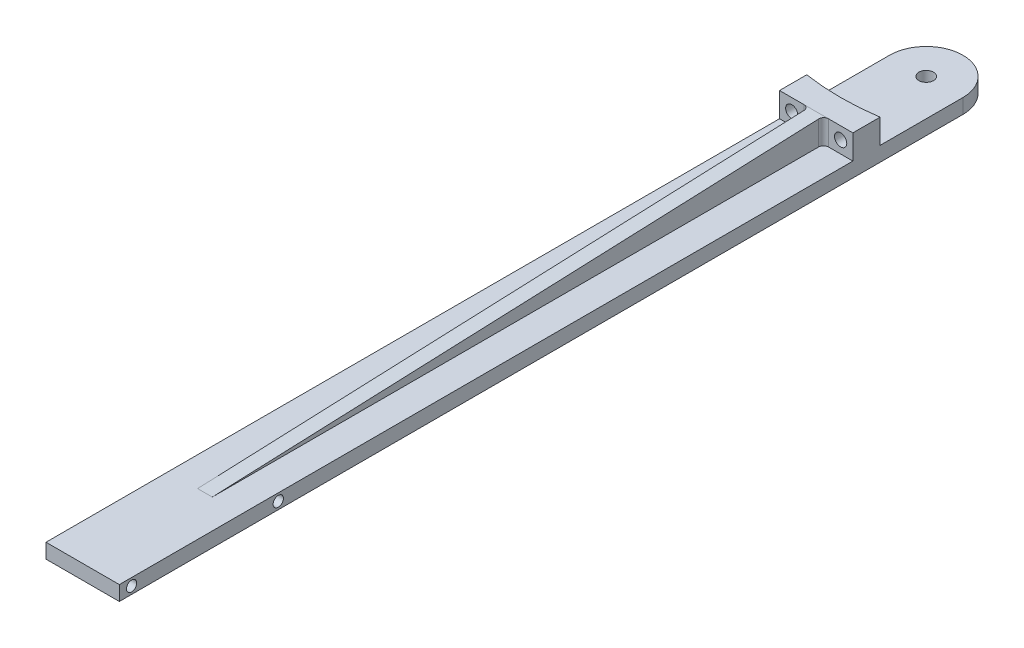
ISO-10303-21;
HEADER;
FILE_DESCRIPTION(('STEP AP214'),'2;1');
FILE_NAME('part.step','',(''),(''),'','','');
FILE_SCHEMA(('AUTOMOTIVE_DESIGN { 1 0 10303 214 1 1 1 1 }'));
ENDSEC;
DATA;
#1=APPLICATION_CONTEXT('core data for automotive mechanical design processes');
#2=APPLICATION_PROTOCOL_DEFINITION('international standard','automotive_design',2000,#1);
#3=PRODUCT_CONTEXT('',#1,'mechanical');
#4=PRODUCT('Part','Part','',(#3));
#5=PRODUCT_RELATED_PRODUCT_CATEGORY('part','',(#4));
#6=PRODUCT_DEFINITION_FORMATION('','',#4);
#7=PRODUCT_DEFINITION_CONTEXT('part definition',#1,'design');
#8=PRODUCT_DEFINITION('design','',#6,#7);
#9=PRODUCT_DEFINITION_SHAPE('','',#8);
#10=(LENGTH_UNIT() NAMED_UNIT(*) SI_UNIT(.MILLI.,.METRE.));
#11=(NAMED_UNIT(*) PLANE_ANGLE_UNIT() SI_UNIT($,.RADIAN.));
#12=(NAMED_UNIT(*) SI_UNIT($,.STERADIAN.) SOLID_ANGLE_UNIT());
#13=UNCERTAINTY_MEASURE_WITH_UNIT(LENGTH_MEASURE(1.E-05),#10,'distance_accuracy_value','');
#14=(GEOMETRIC_REPRESENTATION_CONTEXT(3) GLOBAL_UNCERTAINTY_ASSIGNED_CONTEXT((#13)) GLOBAL_UNIT_ASSIGNED_CONTEXT((#10,
#11,#12)) REPRESENTATION_CONTEXT('',''));
#15=CARTESIAN_POINT('',(0.,0.,0.));
#16=DIRECTION('',(0.,0.,1.));
#17=DIRECTION('',(1.,0.,0.));
#18=AXIS2_PLACEMENT_3D('',#15,#16,#17);
#19=CARTESIAN_POINT('',(0.,0.,300.));
#20=DIRECTION('',(1.,0.,0.));
#21=DIRECTION('',(0.,0.,-1.));
#22=AXIS2_PLACEMENT_3D('',#19,#20,#21);
#23=PLANE('',#22);
#24=DIRECTION('',(0.,0.,-1.));
#25=VECTOR('',#24,1.);
#26=CARTESIAN_POINT('',(0.,6.,300.));
#27=LINE('',#26,#25);
#28=CARTESIAN_POINT('',(0.,6.,300.));
#29=VERTEX_POINT('',#28);
#30=CARTESIAN_POINT('',(0.,6.,0.));
#31=VERTEX_POINT('',#30);
#32=EDGE_CURVE('E474',#29,#31,#27,.T.);
#33=ORIENTED_EDGE('',*,*,#32,.T.);
#34=DIRECTION('',(0.,1.,0.));
#35=VECTOR('',#34,1.);
#36=CARTESIAN_POINT('',(0.,0.,0.));
#37=LINE('',#36,#35);
#38=CARTESIAN_POINT('',(0.,16.,0.));
#39=VERTEX_POINT('',#38);
#40=EDGE_CURVE('E508',#31,#39,#37,.T.);
#41=ORIENTED_EDGE('',*,*,#40,.T.);
#42=DIRECTION('',(0.,0.,1.));
#43=VECTOR('',#42,1.);
#44=CARTESIAN_POINT('',(0.,16.,-10.));
#45=LINE('',#44,#43);
#46=CARTESIAN_POINT('',(0.,16.,-11.1314003335741));
#47=VERTEX_POINT('',#46);
#48=EDGE_CURVE('E497',#47,#39,#45,.T.);
#49=ORIENTED_EDGE('',*,*,#48,.F.);
#50=DIRECTION('',(0.,1.,0.));
#51=VECTOR('',#50,1.);
#52=CARTESIAN_POINT('',(0.,6.,-11.1314003335741));
#53=LINE('',#52,#51);
#54=CARTESIAN_POINT('',(0.,6.,-11.131400333574));
#55=VERTEX_POINT('',#54);
#56=EDGE_CURVE('E576',#55,#47,#53,.T.);
#57=ORIENTED_EDGE('',*,*,#56,.F.);
#58=DIRECTION('',(0.,0.,-1.));
#59=VECTOR('',#58,1.);
#60=CARTESIAN_POINT('',(0.,6.,-10.));
#61=LINE('',#60,#59);
#62=CARTESIAN_POINT('',(0.,6.,-45.));
#63=VERTEX_POINT('',#62);
#64=EDGE_CURVE('E525',#55,#63,#61,.T.);
#65=ORIENTED_EDGE('',*,*,#64,.T.);
#66=DIRECTION('',(0.,-1.,0.));
#67=VECTOR('',#66,1.);
#68=CARTESIAN_POINT('',(0.,6.,-45.));
#69=LINE('',#68,#67);
#70=CARTESIAN_POINT('',(0.,0.,-45.));
#71=VERTEX_POINT('',#70);
#72=EDGE_CURVE('E462',#63,#71,#69,.T.);
#73=ORIENTED_EDGE('',*,*,#72,.T.);
#74=DIRECTION('',(0.,0.,-1.));
#75=VECTOR('',#74,1.);
#76=CARTESIAN_POINT('',(0.,0.,300.));
#77=LINE('',#76,#75);
#78=CARTESIAN_POINT('',(0.,0.,300.));
#79=VERTEX_POINT('',#78);
#80=EDGE_CURVE('E156',#79,#71,#77,.T.);
#81=ORIENTED_EDGE('',*,*,#80,.F.);
#82=DIRECTION('',(0.,-1.,0.));
#83=VECTOR('',#82,1.);
#84=CARTESIAN_POINT('',(0.,0.,300.));
#85=LINE('',#84,#83);
#86=EDGE_CURVE('E117',#29,#79,#85,.T.);
#87=ORIENTED_EDGE('',*,*,#86,.F.);
#88=EDGE_LOOP('',(#33,#41,#49,#57,#65,#73,#81,#87));
#89=FACE_BOUND('',#88,.T.);
#90=CARTESIAN_POINT('',(0.,2.99999999999999,235.));
#91=DIRECTION('',(-1.,0.,0.));
#92=DIRECTION('',(0.,0.,1.));
#93=AXIS2_PLACEMENT_3D('',#90,#91,#92);
#94=CIRCLE('',#93,2.09999999999999);
#95=CARTESIAN_POINT('',(0.,2.99999999999999,237.1));
#96=VERTEX_POINT('',#95);
#97=EDGE_CURVE('E544',#96,#96,#94,.T.);
#98=ORIENTED_EDGE('',*,*,#97,.F.);
#99=EDGE_LOOP('',(#98));
#100=FACE_BOUND('',#99,.T.);
#101=CARTESIAN_POINT('',(0.,3.,295.));
#102=DIRECTION('',(-1.,0.,0.));
#103=DIRECTION('',(0.,0.,1.));
#104=AXIS2_PLACEMENT_3D('',#101,#102,#103);
#105=CIRCLE('',#104,2.09999999999999);
#106=CARTESIAN_POINT('',(0.,3.,297.1));
#107=VERTEX_POINT('',#106);
#108=EDGE_CURVE('E553',#107,#107,#105,.T.);
#109=ORIENTED_EDGE('',*,*,#108,.F.);
#110=EDGE_LOOP('',(#109));
#111=FACE_BOUND('',#110,.T.);
#112=ADVANCED_FACE('F41',(#89,#100,#111),#23,.F.);
#113=CARTESIAN_POINT('',(0.,0.,300.));
#114=DIRECTION('',(0.,1.,0.));
#115=DIRECTION('',(0.,0.,1.));
#116=AXIS2_PLACEMENT_3D('',#113,#114,#115);
#117=PLANE('',#116);
#118=ORIENTED_EDGE('',*,*,#80,.T.);
#119=CARTESIAN_POINT('',(15.,0.,-45.));
#120=DIRECTION('',(0.,-1.,0.));
#121=DIRECTION('',(0.,0.,-1.));
#122=AXIS2_PLACEMENT_3D('',#119,#120,#121);
#123=CIRCLE('',#122,15.);
#124=CARTESIAN_POINT('',(30.,0.,-45.));
#125=VERTEX_POINT('',#124);
#126=EDGE_CURVE('E522',#71,#125,#123,.T.);
#127=ORIENTED_EDGE('',*,*,#126,.T.);
#128=DIRECTION('',(0.,0.,-1.));
#129=VECTOR('',#128,1.);
#130=CARTESIAN_POINT('',(30.,0.,300.));
#131=LINE('',#130,#129);
#132=CARTESIAN_POINT('',(30.,0.,300.));
#133=VERTEX_POINT('',#132);
#134=EDGE_CURVE('E466',#133,#125,#131,.T.);
#135=ORIENTED_EDGE('',*,*,#134,.F.);
#136=DIRECTION('',(1.,0.,0.));
#137=VECTOR('',#136,1.);
#138=CARTESIAN_POINT('',(0.,0.,300.));
#139=LINE('',#138,#137);
#140=EDGE_CURVE('E448',#79,#133,#139,.T.);
#141=ORIENTED_EDGE('',*,*,#140,.F.);
#142=EDGE_LOOP('',(#118,#127,#135,#141));
#143=FACE_BOUND('',#142,.T.);
#144=CARTESIAN_POINT('',(15.,0.,-45.));
#145=DIRECTION('',(0.,-1.,0.));
#146=DIRECTION('',(0.,0.,-1.));
#147=AXIS2_PLACEMENT_3D('',#144,#145,#146);
#148=CIRCLE('',#147,2.99999999999999);
#149=CARTESIAN_POINT('',(15.,0.,-48.));
#150=VERTEX_POINT('',#149);
#151=EDGE_CURVE('E536',#150,#150,#148,.T.);
#152=ORIENTED_EDGE('',*,*,#151,.F.);
#153=EDGE_LOOP('',(#152));
#154=FACE_BOUND('',#153,.T.);
#155=ADVANCED_FACE('F193',(#143,#154),#117,.F.);
#156=CARTESIAN_POINT('',(30.,0.,300.));
#157=DIRECTION('',(-1.,0.,0.));
#158=DIRECTION('',(0.,0.,1.));
#159=AXIS2_PLACEMENT_3D('',#156,#157,#158);
#160=PLANE('',#159);
#161=DIRECTION('',(0.,-1.,0.));
#162=VECTOR('',#161,1.);
#163=CARTESIAN_POINT('',(30.,0.,0.));
#164=LINE('',#163,#162);
#165=CARTESIAN_POINT('',(30.,16.,0.));
#166=VERTEX_POINT('',#165);
#167=CARTESIAN_POINT('',(30.,6.,0.));
#168=VERTEX_POINT('',#167);
#169=EDGE_CURVE('E512',#166,#168,#164,.T.);
#170=ORIENTED_EDGE('',*,*,#169,.T.);
#171=DIRECTION('',(0.,0.,-1.));
#172=VECTOR('',#171,1.);
#173=CARTESIAN_POINT('',(30.,6.,300.));
#174=LINE('',#173,#172);
#175=CARTESIAN_POINT('',(30.,6.,300.));
#176=VERTEX_POINT('',#175);
#177=EDGE_CURVE('E115',#176,#168,#174,.T.);
#178=ORIENTED_EDGE('',*,*,#177,.F.);
#179=DIRECTION('',(0.,1.,0.));
#180=VECTOR('',#179,1.);
#181=CARTESIAN_POINT('',(30.,0.,300.));
#182=LINE('',#181,#180);
#183=EDGE_CURVE('E479',#133,#176,#182,.T.);
#184=ORIENTED_EDGE('',*,*,#183,.F.);
#185=ORIENTED_EDGE('',*,*,#134,.T.);
#186=DIRECTION('',(0.,-1.,0.));
#187=VECTOR('',#186,1.);
#188=CARTESIAN_POINT('',(30.,6.,-45.));
#189=LINE('',#188,#187);
#190=CARTESIAN_POINT('',(30.,6.,-45.));
#191=VERTEX_POINT('',#190);
#192=EDGE_CURVE('E515',#191,#125,#189,.T.);
#193=ORIENTED_EDGE('',*,*,#192,.F.);
#194=DIRECTION('',(0.,0.,1.));
#195=VECTOR('',#194,1.);
#196=CARTESIAN_POINT('',(30.,6.,-45.));
#197=LINE('',#196,#195);
#198=CARTESIAN_POINT('',(30.,6.,-11.1314003335741));
#199=VERTEX_POINT('',#198);
#200=EDGE_CURVE('E518',#191,#199,#197,.T.);
#201=ORIENTED_EDGE('',*,*,#200,.T.);
#202=DIRECTION('',(0.,1.,0.));
#203=VECTOR('',#202,1.);
#204=CARTESIAN_POINT('',(30.,6.,-11.1314003335741));
#205=LINE('',#204,#203);
#206=CARTESIAN_POINT('',(30.,16.,-11.1314003335741));
#207=VERTEX_POINT('',#206);
#208=EDGE_CURVE('E565',#199,#207,#205,.T.);
#209=ORIENTED_EDGE('',*,*,#208,.T.);
#210=DIRECTION('',(0.,0.,1.));
#211=VECTOR('',#210,1.);
#212=CARTESIAN_POINT('',(30.,16.,-10.));
#213=LINE('',#212,#211);
#214=EDGE_CURVE('E501',#207,#166,#213,.T.);
#215=ORIENTED_EDGE('',*,*,#214,.T.);
#216=EDGE_LOOP('',(#170,#178,#184,#185,#193,#201,#209,#215));
#217=FACE_BOUND('',#216,.T.);
#218=CARTESIAN_POINT('',(30.,2.99999999999999,235.));
#219=DIRECTION('',(-1.,0.,0.));
#220=DIRECTION('',(0.,0.,1.));
#221=AXIS2_PLACEMENT_3D('',#218,#219,#220);
#222=CIRCLE('',#221,2.09999999999999);
#223=CARTESIAN_POINT('',(30.,2.99999999999999,237.1));
#224=VERTEX_POINT('',#223);
#225=EDGE_CURVE('E560',#224,#224,#222,.T.);
#226=ORIENTED_EDGE('',*,*,#225,.T.);
#227=EDGE_LOOP('',(#226));
#228=FACE_BOUND('',#227,.T.);
#229=CARTESIAN_POINT('',(30.,3.,295.));
#230=DIRECTION('',(-1.,0.,0.));
#231=DIRECTION('',(0.,0.,1.));
#232=AXIS2_PLACEMENT_3D('',#229,#230,#231);
#233=CIRCLE('',#232,2.09999999999999);
#234=CARTESIAN_POINT('',(30.,3.,297.1));
#235=VERTEX_POINT('',#234);
#236=EDGE_CURVE('E569',#235,#235,#233,.T.);
#237=ORIENTED_EDGE('',*,*,#236,.T.);
#238=EDGE_LOOP('',(#237));
#239=FACE_BOUND('',#238,.T.);
#240=ADVANCED_FACE('F199',(#217,#228,#239),#160,.F.);
#241=CARTESIAN_POINT('',(0.,6.,300.));
#242=DIRECTION('',(0.,-1.,0.));
#243=DIRECTION('',(0.,0.,-1.));
#244=AXIS2_PLACEMENT_3D('',#241,#242,#243);
#245=PLANE('',#244);
#246=DIRECTION('',(0.,0.,-1.));
#247=VECTOR('',#246,1.);
#248=CARTESIAN_POINT('',(12.,6.,0.));
#249=LINE('',#248,#247);
#250=CARTESIAN_POINT('',(12.,6.,250.));
#251=VERTEX_POINT('',#250);
#252=CARTESIAN_POINT('',(12.,6.,2.));
#253=VERTEX_POINT('',#252);
#254=EDGE_CURVE('E145',#251,#253,#249,.T.);
#255=ORIENTED_EDGE('',*,*,#254,.T.);
#256=CARTESIAN_POINT('',(10.,6.,2.));
#257=DIRECTION('',(0.,-1.,0.));
#258=DIRECTION('',(0.,0.,-1.));
#259=AXIS2_PLACEMENT_3D('',#256,#257,#258);
#260=CIRCLE('',#259,2.);
#261=CARTESIAN_POINT('',(10.,6.,0.));
#262=VERTEX_POINT('',#261);
#263=EDGE_CURVE('E86',#253,#262,#260,.F.);
#264=ORIENTED_EDGE('',*,*,#263,.T.);
#265=DIRECTION('',(-1.,0.,0.));
#266=VECTOR('',#265,1.);
#267=CARTESIAN_POINT('',(0.,6.,0.));
#268=LINE('',#267,#266);
#269=EDGE_CURVE('E118',#262,#31,#268,.T.);
#270=ORIENTED_EDGE('',*,*,#269,.T.);
#271=ORIENTED_EDGE('',*,*,#32,.F.);
#272=DIRECTION('',(-1.,0.,0.));
#273=VECTOR('',#272,1.);
#274=CARTESIAN_POINT('',(0.,6.,300.));
#275=LINE('',#274,#273);
#276=EDGE_CURVE('E451',#176,#29,#275,.T.);
#277=ORIENTED_EDGE('',*,*,#276,.F.);
#278=ORIENTED_EDGE('',*,*,#177,.T.);
#279=CARTESIAN_POINT('',(20.,6.,0.));
#280=VERTEX_POINT('',#279);
#281=EDGE_CURVE('E101',#168,#280,#268,.T.);
#282=ORIENTED_EDGE('',*,*,#281,.T.);
#283=CARTESIAN_POINT('',(20.,6.,2.));
#284=DIRECTION('',(0.,-1.,0.));
#285=DIRECTION('',(0.,0.,-1.));
#286=AXIS2_PLACEMENT_3D('',#283,#284,#285);
#287=CIRCLE('',#286,2.);
#288=CARTESIAN_POINT('',(18.,6.,2.));
#289=VERTEX_POINT('',#288);
#290=EDGE_CURVE('E111',#280,#289,#287,.F.);
#291=ORIENTED_EDGE('',*,*,#290,.T.);
#292=DIRECTION('',(0.,0.,-1.));
#293=VECTOR('',#292,1.);
#294=CARTESIAN_POINT('',(18.,6.,0.));
#295=LINE('',#294,#293);
#296=CARTESIAN_POINT('',(18.,6.,250.));
#297=VERTEX_POINT('',#296);
#298=EDGE_CURVE('E147',#297,#289,#295,.T.);
#299=ORIENTED_EDGE('',*,*,#298,.F.);
#300=DIRECTION('',(-1.,0.,0.));
#301=VECTOR('',#300,1.);
#302=CARTESIAN_POINT('',(18.,6.,250.));
#303=LINE('',#302,#301);
#304=EDGE_CURVE('E486',#297,#251,#303,.T.);
#305=ORIENTED_EDGE('',*,*,#304,.T.);
#306=EDGE_LOOP('',(#255,#264,#270,#271,#277,#278,#282,#291,#299,#305));
#307=FACE_BOUND('',#306,.T.);
#308=ADVANCED_FACE('F109',(#307),#245,.F.);
#309=CARTESIAN_POINT('',(0.,0.,300.));
#310=DIRECTION('',(0.,0.,-1.));
#311=DIRECTION('',(-1.,0.,0.));
#312=AXIS2_PLACEMENT_3D('',#309,#310,#311);
#313=PLANE('',#312);
#314=ORIENTED_EDGE('',*,*,#86,.T.);
#315=ORIENTED_EDGE('',*,*,#140,.T.);
#316=ORIENTED_EDGE('',*,*,#183,.T.);
#317=ORIENTED_EDGE('',*,*,#276,.T.);
#318=EDGE_LOOP('',(#314,#315,#316,#317));
#319=FACE_BOUND('',#318,.T.);
#320=ADVANCED_FACE('F277',(#319),#313,.F.);
#321=CARTESIAN_POINT('',(18.,6.,250.));
#322=DIRECTION('',(0.,-0.999200958721789,-0.0399680383488716));
#323=DIRECTION('',(0.,0.0399680383488716,-0.99920095872179));
#324=AXIS2_PLACEMENT_3D('',#321,#322,#323);
#325=PLANE('',#324);
#326=DIRECTION('',(-1.,0.,0.));
#327=VECTOR('',#326,1.);
#328=CARTESIAN_POINT('',(18.,16.,0.));
#329=LINE('',#328,#327);
#330=CARTESIAN_POINT('',(20.,16.,0.));
#331=VERTEX_POINT('',#330);
#332=CARTESIAN_POINT('',(10.,16.,0.));
#333=VERTEX_POINT('',#332);
#334=EDGE_CURVE('E57',#331,#333,#329,.T.);
#335=ORIENTED_EDGE('',*,*,#334,.T.);
#336=CARTESIAN_POINT('',(10.,15.92,2.));
#337=DIRECTION('',(0.,-0.999200958721789,-0.0399680383488716));
#338=DIRECTION('',(0.,0.0399680383488716,-0.99920095872179));
#339=AXIS2_PLACEMENT_3D('',#336,#337,#338);
#340=ELLIPSE('',#339,2.00159936051149,2.);
#341=CARTESIAN_POINT('',(12.,15.92,2.00000000000009));
#342=VERTEX_POINT('',#341);
#343=EDGE_CURVE('E50',#333,#342,#340,.T.);
#344=ORIENTED_EDGE('',*,*,#343,.T.);
#345=DIRECTION('',(0.,-0.0399680383488716,0.999200958721789));
#346=VECTOR('',#345,1.);
#347=CARTESIAN_POINT('',(12.,6.,250.));
#348=LINE('',#347,#346);
#349=EDGE_CURVE('E136',#342,#251,#348,.T.);
#350=ORIENTED_EDGE('',*,*,#349,.T.);
#351=ORIENTED_EDGE('',*,*,#304,.F.);
#352=DIRECTION('',(0.,-0.0399680383488716,0.999200958721789));
#353=VECTOR('',#352,1.);
#354=CARTESIAN_POINT('',(18.,6.,250.));
#355=LINE('',#354,#353);
#356=CARTESIAN_POINT('',(18.,15.92,2.00000000000009));
#357=VERTEX_POINT('',#356);
#358=EDGE_CURVE('E489',#357,#297,#355,.T.);
#359=ORIENTED_EDGE('',*,*,#358,.F.);
#360=CARTESIAN_POINT('',(20.,15.92,2.));
#361=DIRECTION('',(0.,-0.999200958721789,-0.0399680383488716));
#362=DIRECTION('',(0.,-0.0399680383488716,0.99920095872179));
#363=AXIS2_PLACEMENT_3D('',#360,#361,#362);
#364=ELLIPSE('',#363,2.00159936051149,2.);
#365=EDGE_CURVE('E11',#357,#331,#364,.T.);
#366=ORIENTED_EDGE('',*,*,#365,.T.);
#367=EDGE_LOOP('',(#335,#344,#350,#351,#359,#366));
#368=FACE_BOUND('',#367,.T.);
#369=ADVANCED_FACE('F134',(#368),#325,.F.);
#370=CARTESIAN_POINT('',(18.,0.,0.));
#371=DIRECTION('',(1.,0.,0.));
#372=DIRECTION('',(0.,0.,-1.));
#373=AXIS2_PLACEMENT_3D('',#370,#371,#372);
#374=PLANE('',#373);
#375=ORIENTED_EDGE('',*,*,#298,.T.);
#376=DIRECTION('',(0.,1.,0.));
#377=VECTOR('',#376,1.);
#378=CARTESIAN_POINT('',(18.,16.,2.));
#379=LINE('',#378,#377);
#380=EDGE_CURVE('E106',#289,#357,#379,.T.);
#381=ORIENTED_EDGE('',*,*,#380,.T.);
#382=ORIENTED_EDGE('',*,*,#358,.T.);
#383=EDGE_LOOP('',(#375,#381,#382));
#384=FACE_BOUND('',#383,.T.);
#385=ADVANCED_FACE('F258',(#384),#374,.T.);
#386=CARTESIAN_POINT('',(12.,0.,0.));
#387=DIRECTION('',(1.,0.,0.));
#388=DIRECTION('',(0.,0.,-1.));
#389=AXIS2_PLACEMENT_3D('',#386,#387,#388);
#390=PLANE('',#389);
#391=ORIENTED_EDGE('',*,*,#349,.F.);
#392=DIRECTION('',(0.,1.,0.));
#393=VECTOR('',#392,1.);
#394=CARTESIAN_POINT('',(12.,0.,2.));
#395=LINE('',#394,#393);
#396=EDGE_CURVE('E121',#342,#253,#395,.F.);
#397=ORIENTED_EDGE('',*,*,#396,.T.);
#398=ORIENTED_EDGE('',*,*,#254,.F.);
#399=EDGE_LOOP('',(#391,#397,#398));
#400=FACE_BOUND('',#399,.T.);
#401=ADVANCED_FACE('F144',(#400),#390,.F.);
#402=CARTESIAN_POINT('',(0.,0.,0.));
#403=DIRECTION('',(0.,0.,1.));
#404=DIRECTION('',(1.,0.,0.));
#405=AXIS2_PLACEMENT_3D('',#402,#403,#404);
#406=PLANE('',#405);
#407=CARTESIAN_POINT('',(5.,11.,0.));
#408=DIRECTION('',(0.,0.,1.));
#409=DIRECTION('',(1.,0.,0.));
#410=AXIS2_PLACEMENT_3D('',#407,#408,#409);
#411=CIRCLE('',#410,2.5);
#412=CARTESIAN_POINT('',(7.5,11.,0.));
#413=VERTEX_POINT('',#412);
#414=EDGE_CURVE('E590',#413,#413,#411,.T.);
#415=ORIENTED_EDGE('',*,*,#414,.F.);
#416=EDGE_LOOP('',(#415));
#417=FACE_BOUND('',#416,.T.);
#418=ORIENTED_EDGE('',*,*,#269,.F.);
#419=DIRECTION('',(0.,1.,0.));
#420=VECTOR('',#419,1.);
#421=CARTESIAN_POINT('',(10.,0.,0.));
#422=LINE('',#421,#420);
#423=EDGE_CURVE('E126',#262,#333,#422,.T.);
#424=ORIENTED_EDGE('',*,*,#423,.T.);
#425=DIRECTION('',(1.,0.,0.));
#426=VECTOR('',#425,1.);
#427=CARTESIAN_POINT('',(30.,16.,0.));
#428=LINE('',#427,#426);
#429=EDGE_CURVE('E505',#39,#333,#428,.T.);
#430=ORIENTED_EDGE('',*,*,#429,.F.);
#431=ORIENTED_EDGE('',*,*,#40,.F.);
#432=EDGE_LOOP('',(#418,#424,#430,#431));
#433=FACE_BOUND('',#432,.T.);
#434=ADVANCED_FACE('F239',(#417,#433),#406,.T.);
#435=CARTESIAN_POINT('',(25.,11.,0.));
#436=DIRECTION('',(0.,0.,1.));
#437=DIRECTION('',(-1.,0.,0.));
#438=AXIS2_PLACEMENT_3D('',#435,#436,#437);
#439=CIRCLE('',#438,2.5);
#440=CARTESIAN_POINT('',(22.5,11.,0.));
#441=VERTEX_POINT('',#440);
#442=EDGE_CURVE('E586',#441,#441,#439,.T.);
#443=ORIENTED_EDGE('',*,*,#442,.F.);
#444=EDGE_LOOP('',(#443));
#445=FACE_BOUND('',#444,.T.);
#446=EDGE_CURVE('E103',#331,#166,#428,.T.);
#447=ORIENTED_EDGE('',*,*,#446,.F.);
#448=DIRECTION('',(0.,1.,0.));
#449=VECTOR('',#448,1.);
#450=CARTESIAN_POINT('',(20.,6.,0.));
#451=LINE('',#450,#449);
#452=EDGE_CURVE('E96',#331,#280,#451,.F.);
#453=ORIENTED_EDGE('',*,*,#452,.T.);
#454=ORIENTED_EDGE('',*,*,#281,.F.);
#455=ORIENTED_EDGE('',*,*,#169,.F.);
#456=EDGE_LOOP('',(#447,#453,#454,#455));
#457=FACE_BOUND('',#456,.T.);
#458=ADVANCED_FACE('F98',(#445,#457),#406,.T.);
#459=CARTESIAN_POINT('',(30.,16.,-10.));
#460=DIRECTION('',(0.,-1.,0.));
#461=DIRECTION('',(1.,0.,0.));
#462=AXIS2_PLACEMENT_3D('',#459,#460,#461);
#463=PLANE('',#462);
#464=ORIENTED_EDGE('',*,*,#429,.T.);
#465=ORIENTED_EDGE('',*,*,#334,.F.);
#466=ORIENTED_EDGE('',*,*,#446,.T.);
#467=ORIENTED_EDGE('',*,*,#214,.F.);
#468=CARTESIAN_POINT('',(15.,16.,-110.));
#469=DIRECTION('',(0.,-1.,0.));
#470=DIRECTION('',(-1.,0.,0.));
#471=AXIS2_PLACEMENT_3D('',#468,#469,#470);
#472=CIRCLE('',#471,100.);
#473=EDGE_CURVE('E168',#207,#47,#472,.T.);
#474=ORIENTED_EDGE('',*,*,#473,.T.);
#475=ORIENTED_EDGE('',*,*,#48,.T.);
#476=EDGE_LOOP('',(#464,#465,#466,#467,#474,#475));
#477=FACE_BOUND('',#476,.T.);
#478=ADVANCED_FACE('F221',(#477),#463,.F.);
#479=CARTESIAN_POINT('',(15.,6.,-45.));
#480=DIRECTION('',(0.,-1.,0.));
#481=DIRECTION('',(0.,0.,-1.));
#482=AXIS2_PLACEMENT_3D('',#479,#480,#481);
#483=CYLINDRICAL_SURFACE('',#482,15.);
#484=ORIENTED_EDGE('',*,*,#126,.F.);
#485=ORIENTED_EDGE('',*,*,#72,.F.);
#486=CARTESIAN_POINT('',(15.,6.,-45.));
#487=DIRECTION('',(0.,-1.,0.));
#488=DIRECTION('',(0.,0.,-1.));
#489=AXIS2_PLACEMENT_3D('',#486,#487,#488);
#490=CIRCLE('',#489,15.);
#491=EDGE_CURVE('E530',#63,#191,#490,.T.);
#492=ORIENTED_EDGE('',*,*,#491,.T.);
#493=ORIENTED_EDGE('',*,*,#192,.T.);
#494=EDGE_LOOP('',(#484,#485,#492,#493));
#495=FACE_BOUND('',#494,.T.);
#496=ADVANCED_FACE('F226',(#495),#483,.T.);
#497=CARTESIAN_POINT('',(15.,6.,-45.));
#498=DIRECTION('',(0.,-1.,0.));
#499=DIRECTION('',(0.,0.,-1.));
#500=AXIS2_PLACEMENT_3D('',#497,#498,#499);
#501=PLANE('',#500);
#502=CARTESIAN_POINT('',(15.,6.,-45.));
#503=DIRECTION('',(0.,-1.,0.));
#504=DIRECTION('',(0.,0.,-1.));
#505=AXIS2_PLACEMENT_3D('',#502,#503,#504);
#506=CIRCLE('',#505,2.99999999999999);
#507=CARTESIAN_POINT('',(15.,6.,-48.));
#508=VERTEX_POINT('',#507);
#509=EDGE_CURVE('E526',#508,#508,#506,.T.);
#510=ORIENTED_EDGE('',*,*,#509,.T.);
#511=EDGE_LOOP('',(#510));
#512=FACE_BOUND('',#511,.T.);
#513=ORIENTED_EDGE('',*,*,#64,.F.);
#514=CARTESIAN_POINT('',(15.,6.,-110.));
#515=DIRECTION('',(0.,-1.,0.));
#516=DIRECTION('',(0.,0.,-1.));
#517=AXIS2_PLACEMENT_3D('',#514,#515,#516);
#518=CIRCLE('',#517,100.);
#519=EDGE_CURVE('E153',#55,#199,#518,.F.);
#520=ORIENTED_EDGE('',*,*,#519,.T.);
#521=ORIENTED_EDGE('',*,*,#200,.F.);
#522=ORIENTED_EDGE('',*,*,#491,.F.);
#523=EDGE_LOOP('',(#513,#520,#521,#522));
#524=FACE_BOUND('',#523,.T.);
#525=ADVANCED_FACE('F309',(#512,#524),#501,.F.);
#526=CARTESIAN_POINT('',(15.,6.,-45.));
#527=DIRECTION('',(0.,-1.,0.));
#528=DIRECTION('',(0.,0.,-1.));
#529=AXIS2_PLACEMENT_3D('',#526,#527,#528);
#530=CYLINDRICAL_SURFACE('',#529,2.99999999999999);
#531=ORIENTED_EDGE('',*,*,#509,.F.);
#532=EDGE_LOOP('',(#531));
#533=FACE_BOUND('',#532,.T.);
#534=ORIENTED_EDGE('',*,*,#151,.T.);
#535=EDGE_LOOP('',(#534));
#536=FACE_BOUND('',#535,.T.);
#537=ADVANCED_FACE('F314',(#533,#536),#530,.F.);
#538=CARTESIAN_POINT('',(12.,2.99999999999999,235.));
#539=DIRECTION('',(-1.,0.,0.));
#540=DIRECTION('',(0.,0.,1.));
#541=AXIS2_PLACEMENT_3D('',#538,#539,#540);
#542=CYLINDRICAL_SURFACE('',#541,2.09999999999999);
#543=CARTESIAN_POINT('',(12.,2.99999999999999,235.));
#544=DIRECTION('',(-1.,0.,0.));
#545=DIRECTION('',(0.,0.,1.));
#546=AXIS2_PLACEMENT_3D('',#543,#544,#545);
#547=CIRCLE('',#546,2.09999999999999);
#548=CARTESIAN_POINT('',(12.,2.99999999999999,237.1));
#549=VERTEX_POINT('',#548);
#550=EDGE_CURVE('E548',#549,#549,#547,.T.);
#551=ORIENTED_EDGE('',*,*,#550,.F.);
#552=EDGE_LOOP('',(#551));
#553=FACE_BOUND('',#552,.T.);
#554=ORIENTED_EDGE('',*,*,#97,.T.);
#555=EDGE_LOOP('',(#554));
#556=FACE_BOUND('',#555,.T.);
#557=ADVANCED_FACE('F397',(#553,#556),#542,.F.);
#558=CARTESIAN_POINT('',(12.,2.99999999999999,235.));
#559=DIRECTION('',(-1.,0.,0.));
#560=DIRECTION('',(0.,0.,1.));
#561=AXIS2_PLACEMENT_3D('',#558,#559,#560);
#562=PLANE('',#561);
#563=ORIENTED_EDGE('',*,*,#550,.T.);
#564=EDGE_LOOP('',(#563));
#565=FACE_BOUND('',#564,.T.);
#566=ADVANCED_FACE('F387',(#565),#562,.T.);
#567=CARTESIAN_POINT('',(12.,3.,295.));
#568=DIRECTION('',(-1.,0.,0.));
#569=DIRECTION('',(0.,0.,1.));
#570=AXIS2_PLACEMENT_3D('',#567,#568,#569);
#571=CYLINDRICAL_SURFACE('',#570,2.09999999999999);
#572=CARTESIAN_POINT('',(12.,3.,295.));
#573=DIRECTION('',(-1.,0.,0.));
#574=DIRECTION('',(0.,0.,1.));
#575=AXIS2_PLACEMENT_3D('',#572,#573,#574);
#576=CIRCLE('',#575,2.09999999999999);
#577=CARTESIAN_POINT('',(12.,3.,297.1));
#578=VERTEX_POINT('',#577);
#579=EDGE_CURVE('E540',#578,#578,#576,.T.);
#580=ORIENTED_EDGE('',*,*,#579,.F.);
#581=EDGE_LOOP('',(#580));
#582=FACE_BOUND('',#581,.T.);
#583=ORIENTED_EDGE('',*,*,#108,.T.);
#584=EDGE_LOOP('',(#583));
#585=FACE_BOUND('',#584,.T.);
#586=ADVANCED_FACE('F377',(#582,#585),#571,.F.);
#587=CARTESIAN_POINT('',(12.,3.,295.));
#588=DIRECTION('',(-1.,0.,0.));
#589=DIRECTION('',(0.,0.,1.));
#590=AXIS2_PLACEMENT_3D('',#587,#588,#589);
#591=PLANE('',#590);
#592=ORIENTED_EDGE('',*,*,#579,.T.);
#593=EDGE_LOOP('',(#592));
#594=FACE_BOUND('',#593,.T.);
#595=ADVANCED_FACE('F367',(#594),#591,.T.);
#596=CARTESIAN_POINT('',(18.,2.99999999999999,235.));
#597=DIRECTION('',(1.,0.,0.));
#598=DIRECTION('',(0.,0.,-1.));
#599=AXIS2_PLACEMENT_3D('',#596,#597,#598);
#600=CYLINDRICAL_SURFACE('',#599,2.09999999999999);
#601=CARTESIAN_POINT('',(18.,2.99999999999999,235.));
#602=DIRECTION('',(-1.,0.,0.));
#603=DIRECTION('',(0.,0.,1.));
#604=AXIS2_PLACEMENT_3D('',#601,#602,#603);
#605=CIRCLE('',#604,2.09999999999999);
#606=CARTESIAN_POINT('',(18.,2.99999999999999,237.1));
#607=VERTEX_POINT('',#606);
#608=EDGE_CURVE('E564',#607,#607,#605,.T.);
#609=ORIENTED_EDGE('',*,*,#608,.T.);
#610=EDGE_LOOP('',(#609));
#611=FACE_BOUND('',#610,.T.);
#612=ORIENTED_EDGE('',*,*,#225,.F.);
#613=EDGE_LOOP('',(#612));
#614=FACE_BOUND('',#613,.T.);
#615=ADVANCED_FACE('F357',(#611,#614),#600,.F.);
#616=CARTESIAN_POINT('',(18.,2.99999999999999,235.));
#617=DIRECTION('',(-1.,0.,0.));
#618=DIRECTION('',(0.,0.,1.));
#619=AXIS2_PLACEMENT_3D('',#616,#617,#618);
#620=PLANE('',#619);
#621=ORIENTED_EDGE('',*,*,#608,.F.);
#622=EDGE_LOOP('',(#621));
#623=FACE_BOUND('',#622,.T.);
#624=ADVANCED_FACE('F347',(#623),#620,.F.);
#625=CARTESIAN_POINT('',(18.,3.,295.));
#626=DIRECTION('',(1.,0.,0.));
#627=DIRECTION('',(0.,0.,-1.));
#628=AXIS2_PLACEMENT_3D('',#625,#626,#627);
#629=CYLINDRICAL_SURFACE('',#628,2.09999999999999);
#630=CARTESIAN_POINT('',(18.,3.,295.));
#631=DIRECTION('',(-1.,0.,0.));
#632=DIRECTION('',(0.,0.,1.));
#633=AXIS2_PLACEMENT_3D('',#630,#631,#632);
#634=CIRCLE('',#633,2.09999999999999);
#635=CARTESIAN_POINT('',(18.,3.,297.1));
#636=VERTEX_POINT('',#635);
#637=EDGE_CURVE('E549',#636,#636,#634,.T.);
#638=ORIENTED_EDGE('',*,*,#637,.T.);
#639=EDGE_LOOP('',(#638));
#640=FACE_BOUND('',#639,.T.);
#641=ORIENTED_EDGE('',*,*,#236,.F.);
#642=EDGE_LOOP('',(#641));
#643=FACE_BOUND('',#642,.T.);
#644=ADVANCED_FACE('F338',(#640,#643),#629,.F.);
#645=CARTESIAN_POINT('',(18.,3.,295.));
#646=DIRECTION('',(-1.,0.,0.));
#647=DIRECTION('',(0.,0.,1.));
#648=AXIS2_PLACEMENT_3D('',#645,#646,#647);
#649=PLANE('',#648);
#650=ORIENTED_EDGE('',*,*,#637,.F.);
#651=EDGE_LOOP('',(#650));
#652=FACE_BOUND('',#651,.T.);
#653=ADVANCED_FACE('F188',(#652),#649,.F.);
#654=CARTESIAN_POINT('',(15.,6.,-110.));
#655=DIRECTION('',(0.,1.,0.));
#656=DIRECTION('',(-1.,0.,0.));
#657=AXIS2_PLACEMENT_3D('',#654,#655,#656);
#658=CYLINDRICAL_SURFACE('',#657,100.);
#659=CARTESIAN_POINT('',(7.5,11.,-10.2816466241043));
#660=CARTESIAN_POINT('',(7.49999375941633,10.8598948036859,-10.2816468272773));
#661=CARTESIAN_POINT('',(7.48818231992918,10.7196884703907,-10.2825332712599));
#662=CARTESIAN_POINT('',(7.44123415874968,10.4431417387576,-10.2860812537738));
#663=CARTESIAN_POINT('',(7.40606951590563,10.3068061720273,-10.2887449171711));
#664=CARTESIAN_POINT('',(7.31343540773116,10.0420508025917,-10.2958432656034));
#665=CARTESIAN_POINT('',(7.25597751938828,9.91362693135132,-10.3002770314503));
#666=CARTESIAN_POINT('',(7.12042808224868,9.66830069391578,-10.3108985623425));
#667=CARTESIAN_POINT('',(7.04234159538414,9.55139551086565,-10.3170858971167));
#668=CARTESIAN_POINT('',(6.86767937342826,9.3322386499298,-10.3311832984206));
#669=CARTESIAN_POINT('',(6.77108383070008,9.23000287750452,-10.3390952117831));
#670=CARTESIAN_POINT('',(6.56222550644038,9.04319569726817,-10.3565610764798));
#671=CARTESIAN_POINT('',(6.44996195031069,8.95862516331085,-10.3661151090028));
#672=CARTESIAN_POINT('',(6.2126532537725,8.80929728348206,-10.386764238218));
#673=CARTESIAN_POINT('',(6.08757440786066,8.74459407242472,-10.3978634278017));
#674=CARTESIAN_POINT('',(5.82845189807218,8.63708987136799,-10.4213897731277));
#675=CARTESIAN_POINT('',(5.69440806724752,8.59428928937286,-10.4338169536027));
#676=CARTESIAN_POINT('',(5.42061133455447,8.5316228954875,-10.4597855901552));
#677=CARTESIAN_POINT('',(5.28083820348699,8.51184719331352,-10.4733312034635));
#678=CARTESIAN_POINT('',(5.00002800367899,8.49604762212411,-10.5011534411923));
#679=CARTESIAN_POINT('',(4.85899090624121,8.5000242937568,-10.515430082245));
#680=CARTESIAN_POINT('',(4.5790862553309,8.53165174287772,-10.5443594787904));
#681=CARTESIAN_POINT('',(4.44022897544001,8.55939237157515,-10.5590134567637));
#682=CARTESIAN_POINT('',(4.16915763309419,8.63787982065789,-10.5881724853525));
#683=CARTESIAN_POINT('',(4.03694367914199,8.6886270166645,-10.6026775335326));
#684=CARTESIAN_POINT('',(3.78272302759877,8.81180114058133,-10.6310456107537));
#685=CARTESIAN_POINT('',(3.6607308917294,8.8842583459476,-10.6449077117361));
#686=CARTESIAN_POINT('',(3.430649874635,9.04880986783561,-10.6714362799818));
#687=CARTESIAN_POINT('',(3.32256085513782,9.14090398903601,-10.6841027591357));
#688=CARTESIAN_POINT('',(3.12370113240108,9.34186040522365,-10.7076863693546));
#689=CARTESIAN_POINT('',(3.03288133893595,9.45067353001512,-10.7186084445271));
#690=CARTESIAN_POINT('',(2.87083097903707,9.68219772745815,-10.7382755328699));
#691=CARTESIAN_POINT('',(2.79959970653563,9.80490829895147,-10.7470206245085));
#692=CARTESIAN_POINT('',(2.67923755242169,10.0598895287491,-10.7618899590204));
#693=CARTESIAN_POINT('',(2.62996519764334,10.1920924243742,-10.7680309662239));
#694=CARTESIAN_POINT('',(2.55431118950561,10.4629889592016,-10.7774909749461));
#695=CARTESIAN_POINT('',(2.52792858318392,10.6016823279345,-10.7808100939475));
#696=CARTESIAN_POINT('',(2.49894049184777,10.8806598518844,-10.7844582390261));
#697=CARTESIAN_POINT('',(2.49618213720534,11.0209278892249,-10.7848064891724));
#698=CARTESIAN_POINT('',(2.51412342396364,11.2999294110297,-10.7825470740857));
#699=CARTESIAN_POINT('',(2.53482263169442,11.4386629238155,-10.779939463499));
#700=CARTESIAN_POINT('',(2.59899472419514,11.7103656024529,-10.7718986383285));
#701=CARTESIAN_POINT('',(2.64242034405493,11.8433461139225,-10.7664712882244));
#702=CARTESIAN_POINT('',(2.75074054420988,12.1001130182999,-10.7530423435814));
#703=CARTESIAN_POINT('',(2.81563545372758,12.223899270182,-10.7450407095669));
#704=CARTESIAN_POINT('',(2.96529617516142,12.4592821165441,-10.7267831361309));
#705=CARTESIAN_POINT('',(3.05013574750676,12.5708311527176,-10.7165188377999));
#706=CARTESIAN_POINT('',(3.23711814519215,12.7781263481874,-10.6941922464486));
#707=CARTESIAN_POINT('',(3.33926161657953,12.8738719171919,-10.682129886299));
#708=CARTESIAN_POINT('',(3.55873118284426,13.0475503068293,-10.6566074992587));
#709=CARTESIAN_POINT('',(3.67615803262685,13.1253544683658,-10.6431383260823));
#710=CARTESIAN_POINT('',(3.92231657538962,13.2601530041817,-10.6153922717898));
#711=CARTESIAN_POINT('',(4.05104864365512,13.3171466873173,-10.601115363866));
#712=CARTESIAN_POINT('',(4.31697386633613,13.4090198464815,-10.5721823291567));
#713=CARTESIAN_POINT('',(4.45421127689853,13.4437707343248,-10.5575244981755));
#714=CARTESIAN_POINT('',(4.73259965586106,13.4896584524519,-10.5283956561488));
#715=CARTESIAN_POINT('',(4.87375068321741,13.5007949268031,-10.5139246479223));
#716=CARTESIAN_POINT('',(5.15620164124882,13.499115363095,-10.4855798856453));
#717=CARTESIAN_POINT('',(5.29750144788455,13.4862608982975,-10.4717071262381));
#718=CARTESIAN_POINT('',(5.57599224096914,13.4368487668984,-10.4449516411756));
#719=CARTESIAN_POINT('',(5.71318325801039,13.4002912768259,-10.4320689081478));
#720=CARTESIAN_POINT('',(5.97920920945916,13.3045793740526,-10.407614998369));
#721=CARTESIAN_POINT('',(6.1080626203916,13.2454770783787,-10.3960408758994));
#722=CARTESIAN_POINT('',(6.35403696538515,13.106311706701,-10.3743879026831));
#723=CARTESIAN_POINT('',(6.47115859626433,13.0262498766266,-10.3643089631118));
#724=CARTESIAN_POINT('',(6.68982161923749,12.8477925090712,-10.3458332600793));
#725=CARTESIAN_POINT('',(6.79142547204711,12.7494742010893,-10.3374297088845));
#726=CARTESIAN_POINT('',(6.9767126523729,12.5370338354779,-10.3223418873474));
#727=CARTESIAN_POINT('',(7.06039188251984,12.4229081742597,-10.3156580100334));
#728=CARTESIAN_POINT('',(7.20712834246797,12.1825229354134,-10.3040794761818));
#729=CARTESIAN_POINT('',(7.27024999814648,12.0563029019609,-10.2991792241074));
#730=CARTESIAN_POINT('',(7.37434702119991,11.7951069960597,-10.2911630373473));
#731=CARTESIAN_POINT('',(7.41534921333824,11.6601419524897,-10.2880449411273));
#732=CARTESIAN_POINT('',(7.46309225919086,11.4369264536565,-10.284427820087));
#733=CARTESIAN_POINT('',(7.47691504989899,11.3501354435204,-10.2833851362938));
#734=CARTESIAN_POINT('',(7.495370870221,11.1755761966177,-10.2819944750632));
#735=CARTESIAN_POINT('',(7.50000391115349,11.0878079610549,-10.28164649677));
#736=CARTESIAN_POINT('',(7.5,11.,-10.2816466241043));
#737=B_SPLINE_CURVE_WITH_KNOTS('',3,(#659,#660,#661,#662,#663,#664,#665,#666,#667,#668,#669,
#670,#671,#672,#673,#674,#675,#676,#677,#678,#679,#680,#681,#682,#683,#684,#685,#686,#687,#688,
#689,#690,#691,#692,#693,#694,#695,#696,#697,#698,#699,#700,#701,#702,#703,#704,#705,#706,#707,
#708,#709,#710,#711,#712,#713,#714,#715,#716,#717,#718,#719,#720,#721,#722,#723,#724,#725,#726,
#727,#728,#729,#730,#731,#732,#733,#734,#735,#736),.UNSPECIFIED.,.T.,.F.,(4,2,2,2,2,2,2,2,2,2,2,
2,2,2,2,2,2,2,2,2,2,2,2,2,2,2,2,2,2,2,2,2,2,2,2,2,2,2,4),(0.,0.419994795107592,
0.840492643302277,1.2607724166224,1.68094915556568,2.10157808752706,2.52222782199104,
2.94401378154911,3.3658075978905,3.78924664787118,4.21269533614753,4.63775218077837,
5.06281596543409,5.4884753386254,5.91413047813353,6.33855692607371,6.76296807356861,
7.18460390727864,7.606222186303,8.02511014740152,8.44399036446591,8.86200286354632,
9.28002177296998,9.69961164189196,10.1192171798068,10.5417441431414,10.9642851378854,
11.3892473391264,11.8142159456431,12.2398658165966,12.6655125175448,13.0901811525712,
13.5148245491038,13.9377109117427,14.3606938385829,14.7823381196166,15.2034699072023,
15.4666930638331,15.7299158962639),.UNSPECIFIED.);
#738=CARTESIAN_POINT('',(7.5,11.,-10.2816466241043));
#739=VERTEX_POINT('',#738);
#740=EDGE_CURVE('E159',#739,#739,#737,.T.);
#741=ORIENTED_EDGE('',*,*,#740,.F.);
#742=EDGE_LOOP('',(#741));
#743=FACE_BOUND('',#742,.T.);
#744=CARTESIAN_POINT('',(27.5,11.,-10.7843258350778));
#745=CARTESIAN_POINT('',(27.499993677996,10.8603457892262,-10.7843247718196));
#746=CARTESIAN_POINT('',(27.4882572106246,10.7205903814631,-10.7828441951471));
#747=CARTESIAN_POINT('',(27.4416181104257,10.4449460789098,-10.7769851825015));
#748=CARTESIAN_POINT('',(27.4066876808734,10.3090620277667,-10.7726032694496));
#749=CARTESIAN_POINT('',(27.3147082555502,10.0452100386811,-10.7611462420322));
#750=CARTESIAN_POINT('',(27.2576739663933,9.91723690278493,-10.7540729184304));
#751=CARTESIAN_POINT('',(27.1231692325856,9.67273968135657,-10.7375532407681));
#752=CARTESIAN_POINT('',(27.045703424612,9.55621300641749,-10.7281074251382));
#753=CARTESIAN_POINT('',(26.8722141878023,9.33735465422966,-10.7072098716561));
#754=CARTESIAN_POINT('',(26.7761183753338,9.2350811093818,-10.6957503266134));
#755=CARTESIAN_POINT('',(26.5683036104649,9.04808669353307,-10.6713270191514));
#756=CARTESIAN_POINT('',(26.4565835013795,8.96336712322684,-10.6583631453769));
#757=CARTESIAN_POINT('',(26.2198312166732,8.81326867198923,-10.6313446805198));
#758=CARTESIAN_POINT('',(26.0947109874073,8.74802992750304,-10.6172830630674));
#759=CARTESIAN_POINT('',(25.8353408622891,8.63949786579897,-10.5886706833485));
#760=CARTESIAN_POINT('',(25.7010907119782,8.59620516052001,-10.5741199074544));
#761=CARTESIAN_POINT('',(25.42659206697,8.53262126818809,-10.5449583813797));
#762=CARTESIAN_POINT('',(25.2863187270486,8.5124372641494,-10.5303476646698));
#763=CARTESIAN_POINT('',(25.0043290758666,8.49601749868558,-10.5015905471675));
#764=CARTESIAN_POINT('',(24.8626127594374,8.49978182306898,-10.487444148039));
#765=CARTESIAN_POINT('',(24.581731005792,8.53118948416089,-10.4600062688351));
#766=CARTESIAN_POINT('',(24.4425661649173,8.55883833239695,-10.4467149868449));
#767=CARTESIAN_POINT('',(24.1708056588053,8.63728174604177,-10.4213127200201));
#768=CARTESIAN_POINT('',(24.0382099070796,8.68807600662871,-10.4092017196439));
#769=CARTESIAN_POINT('',(23.7838100986703,8.8112125675546,-10.3864418948848));
#770=CARTESIAN_POINT('',(23.6619736668712,8.88348715284628,-10.3757886269951));
#771=CARTESIAN_POINT('',(23.4321500604867,9.04762072666822,-10.3560730919347));
#772=CARTESIAN_POINT('',(23.3241625858042,9.13947929071268,-10.3470107902873));
#773=CARTESIAN_POINT('',(23.125583247566,9.3397685621974,-10.3306225220305));
#774=CARTESIAN_POINT('',(23.0349220568398,9.44812996811565,-10.3232896068608));
#775=CARTESIAN_POINT('',(22.8730765487941,9.678627162139,-10.3103752701205));
#776=CARTESIAN_POINT('',(22.8018918808193,9.80076270219875,-10.3047938170162));
#777=CARTESIAN_POINT('',(22.6812667475606,10.0549089107028,-10.2954273495931));
#778=CARTESIAN_POINT('',(22.6317559486657,10.1868859858891,-10.291636521326));
#779=CARTESIAN_POINT('',(22.5555731200378,10.4573122192057,-10.2858345713622));
#780=CARTESIAN_POINT('',(22.5289008276212,10.595761302877,-10.2838234291959));
#781=CARTESIAN_POINT('',(22.4991950823825,10.8749280271984,-10.281584954146));
#782=CARTESIAN_POINT('',(22.4961181949801,11.0156410214987,-10.2813543436423));
#783=CARTESIAN_POINT('',(22.5135774008066,11.2955855090092,-10.2826683650162));
#784=CARTESIAN_POINT('',(22.5341133747745,11.4348170096986,-10.2842129879276));
#785=CARTESIAN_POINT('',(22.5981900353952,11.7077808694303,-10.2890751765892));
#786=CARTESIAN_POINT('',(22.641720113671,11.8415157337167,-10.2923919247738));
#787=CARTESIAN_POINT('',(22.7505230541968,12.0997665682526,-10.3007906133167));
#788=CARTESIAN_POINT('',(22.8157959335342,12.2242825312568,-10.3058725550621));
#789=CARTESIAN_POINT('',(22.9662700820896,12.4606816989616,-10.3177838325487));
#790=CARTESIAN_POINT('',(23.0514882465431,12.5725540737395,-10.3246146501895));
#791=CARTESIAN_POINT('',(23.2393733976247,12.7803987528457,-10.3399699643174));
#792=CARTESIAN_POINT('',(23.3420405383026,12.8763709167829,-10.3484944757575));
#793=CARTESIAN_POINT('',(23.5621358092334,13.0499347275043,-10.3671638865532));
#794=CARTESIAN_POINT('',(23.6795968107476,13.1274842970092,-10.3773124084075));
#795=CARTESIAN_POINT('',(23.9257414020287,13.2617747435179,-10.3990643276334));
#796=CARTESIAN_POINT('',(24.05442517826,13.3185152747014,-10.4106677491794));
#797=CARTESIAN_POINT('',(24.3198450871592,13.4098039914888,-10.435155311617));
#798=CARTESIAN_POINT('',(24.4566085812428,13.4442714202698,-10.4480439195517));
#799=CARTESIAN_POINT('',(24.7338899239357,13.4897641825565,-10.4747731409582));
#800=CARTESIAN_POINT('',(24.874407871131,13.5007888998805,-10.4886137794437));
#801=CARTESIAN_POINT('',(25.1558124385297,13.4991198044204,-10.5169383717232));
#802=CARTESIAN_POINT('',(25.2966982535671,13.4863299538333,-10.5314246993909));
#803=CARTESIAN_POINT('',(25.5742932943813,13.4372230034776,-10.5605520541685));
#804=CARTESIAN_POINT('',(25.7110024294945,13.4009053933683,-10.5751930846273));
#805=CARTESIAN_POINT('',(25.9767140310216,13.305644645189,-10.6041768114959));
#806=CARTESIAN_POINT('',(26.1056968596938,13.2466464646214,-10.6185186919401));
#807=CARTESIAN_POINT('',(26.3519186397398,13.1076762217471,-10.6463422256922));
#808=CARTESIAN_POINT('',(26.469158050437,13.0277049802083,-10.6598239126376));
#809=CARTESIAN_POINT('',(26.6883638562289,12.8491565667708,-10.6853770537152));
#810=CARTESIAN_POINT('',(26.7903536692893,12.7506084596548,-10.697450663747));
#811=CARTESIAN_POINT('',(26.9763409067579,12.5375539404775,-10.7197096220862));
#812=CARTESIAN_POINT('',(27.0603343633752,12.4230440183625,-10.7298945539163));
#813=CARTESIAN_POINT('',(27.2074353031936,12.1819785366466,-10.74787657646));
#814=CARTESIAN_POINT('',(27.2706488002423,12.0554884977565,-10.7556857718273));
#815=CARTESIAN_POINT('',(27.3748500730422,11.7936573345395,-10.7686245697199));
#816=CARTESIAN_POINT('',(27.4158657058135,11.6583275438526,-10.7737575304651));
#817=CARTESIAN_POINT('',(27.4634043681228,11.4350859635515,-10.7797205092526));
#818=CARTESIAN_POINT('',(27.4771097809334,11.3486614270137,-10.7814441858869));
#819=CARTESIAN_POINT('',(27.4954095548295,11.174837814119,-10.7837471789978));
#820=CARTESIAN_POINT('',(27.5000039582629,11.0874387422936,-10.7843265007932));
#821=CARTESIAN_POINT('',(27.5,11.,-10.7843258350778));
#822=B_SPLINE_CURVE_WITH_KNOTS('',3,(#744,#745,#746,#747,#748,#749,#750,#751,#752,#753,#754,
#755,#756,#757,#758,#759,#760,#761,#762,#763,#764,#765,#766,#767,#768,#769,#770,#771,#772,#773,
#774,#775,#776,#777,#778,#779,#780,#781,#782,#783,#784,#785,#786,#787,#788,#789,#790,#791,#792,
#793,#794,#795,#796,#797,#798,#799,#800,#801,#802,#803,#804,#805,#806,#807,#808,#809,#810,#811,
#812,#813,#814,#815,#816,#817,#818,#819,#820,#821),.UNSPECIFIED.,.T.,.F.,(4,2,2,2,2,2,2,2,2,2,2,
2,2,2,2,2,2,2,2,2,2,2,2,2,2,2,2,2,2,2,2,2,2,2,2,2,2,2,4),(0.,0.418642075739779,
0.837786779383692,1.25665308612879,1.6754244180809,2.09585665734462,2.51632003819129,
2.9397389588072,3.36316968530163,3.78855651597225,4.21394487083433,4.63943141338171,
5.0649123524931,5.48906597182182,5.91321039848885,6.33562044571659,6.75802288737579,
7.17904424697084,7.60006076400353,8.0203020845285,8.44054128255557,8.86058677148217,
9.28063259051972,9.70103551768337,10.1214421566041,10.5427999674827,10.9641647804846,
11.3870489122238,11.8099441591578,12.234548524599,12.6591621004399,13.0848127251296,
13.5104466947294,13.9354201763165,14.3604872587805,14.7833508319402,15.2056824982573,
15.467799240136,15.7299147636928),.UNSPECIFIED.);
#823=CARTESIAN_POINT('',(27.5,11.,-10.7843258350778));
#824=VERTEX_POINT('',#823);
#825=EDGE_CURVE('E169',#824,#824,#822,.T.);
#826=ORIENTED_EDGE('',*,*,#825,.F.);
#827=EDGE_LOOP('',(#826));
#828=FACE_BOUND('',#827,.T.);
#829=ORIENTED_EDGE('',*,*,#208,.F.);
#830=ORIENTED_EDGE('',*,*,#519,.F.);
#831=ORIENTED_EDGE('',*,*,#56,.T.);
#832=ORIENTED_EDGE('',*,*,#473,.F.);
#833=EDGE_LOOP('',(#829,#830,#831,#832));
#834=FACE_BOUND('',#833,.T.);
#835=ADVANCED_FACE('F174',(#743,#828,#834),#658,.F.);
#836=CARTESIAN_POINT('',(25.,11.,-60.));
#837=DIRECTION('',(0.,0.,1.));
#838=DIRECTION('',(1.,0.,0.));
#839=AXIS2_PLACEMENT_3D('',#836,#837,#838);
#840=CYLINDRICAL_SURFACE('',#839,2.5);
#841=ORIENTED_EDGE('',*,*,#825,.T.);
#842=EDGE_LOOP('',(#841));
#843=FACE_BOUND('',#842,.T.);
#844=ORIENTED_EDGE('',*,*,#442,.T.);
#845=EDGE_LOOP('',(#844));
#846=FACE_BOUND('',#845,.T.);
#847=ADVANCED_FACE('F180',(#843,#846),#840,.F.);
#848=CARTESIAN_POINT('',(5.,11.,-60.));
#849=DIRECTION('',(0.,0.,1.));
#850=DIRECTION('',(1.,0.,0.));
#851=AXIS2_PLACEMENT_3D('',#848,#849,#850);
#852=CYLINDRICAL_SURFACE('',#851,2.5);
#853=ORIENTED_EDGE('',*,*,#740,.T.);
#854=EDGE_LOOP('',(#853));
#855=FACE_BOUND('',#854,.T.);
#856=ORIENTED_EDGE('',*,*,#414,.T.);
#857=EDGE_LOOP('',(#856));
#858=FACE_BOUND('',#857,.T.);
#859=ADVANCED_FACE('F177',(#855,#858),#852,.F.);
#860=CARTESIAN_POINT('',(10.,0.,2.));
#861=DIRECTION('',(0.,1.,0.));
#862=DIRECTION('',(0.,0.,1.));
#863=AXIS2_PLACEMENT_3D('',#860,#861,#862);
#864=CYLINDRICAL_SURFACE('',#863,2.);
#865=ORIENTED_EDGE('',*,*,#263,.F.);
#866=ORIENTED_EDGE('',*,*,#396,.F.);
#867=ORIENTED_EDGE('',*,*,#343,.F.);
#868=ORIENTED_EDGE('',*,*,#423,.F.);
#869=EDGE_LOOP('',(#865,#866,#867,#868));
#870=FACE_BOUND('',#869,.T.);
#871=ADVANCED_FACE('F149',(#870),#864,.F.);
#872=CARTESIAN_POINT('',(20.,0.,2.));
#873=DIRECTION('',(0.,-1.,0.));
#874=DIRECTION('',(0.,0.,-1.));
#875=AXIS2_PLACEMENT_3D('',#872,#873,#874);
#876=CYLINDRICAL_SURFACE('',#875,2.);
#877=ORIENTED_EDGE('',*,*,#290,.F.);
#878=ORIENTED_EDGE('',*,*,#452,.F.);
#879=ORIENTED_EDGE('',*,*,#365,.F.);
#880=ORIENTED_EDGE('',*,*,#380,.F.);
#881=EDGE_LOOP('',(#877,#878,#879,#880));
#882=FACE_BOUND('',#881,.T.);
#883=ADVANCED_FACE('F43',(#882),#876,.F.);
#884=CLOSED_SHELL('',(#112,#155,#240,#308,#320,#369,#385,#401,#434,#458,#478,#496,#525,#537,
#557,#566,#586,#595,#615,#624,#644,#653,#835,#847,#859,#871,#883));
#885=MANIFOLD_SOLID_BREP('B2',#884);
#886=ADVANCED_BREP_SHAPE_REPRESENTATION('',(#18,#885),#14);
#887=SHAPE_DEFINITION_REPRESENTATION(#9,#886);
ENDSEC;
END-ISO-10303-21;
